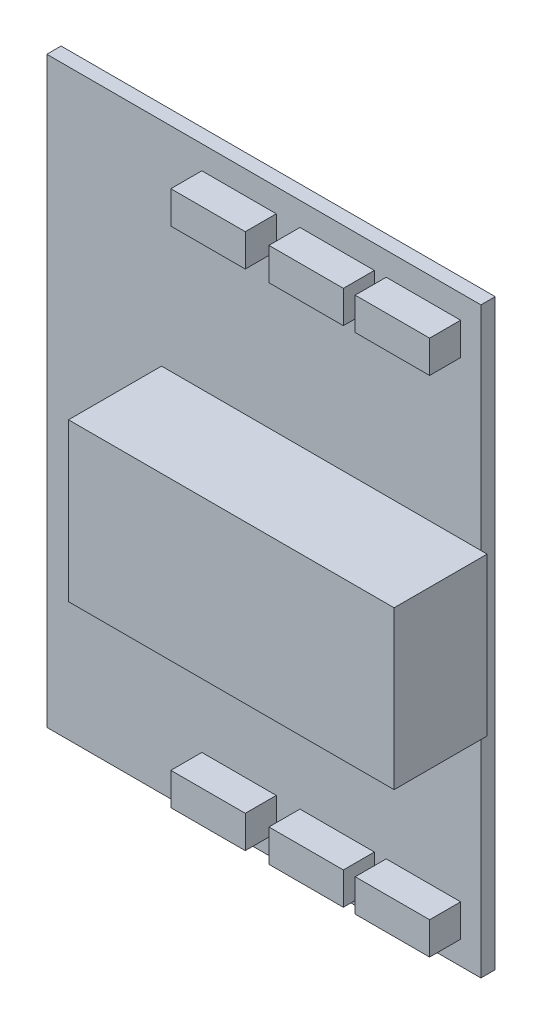
ISO-10303-21;
HEADER;
FILE_DESCRIPTION(('STEP AP214'),'2;1');
FILE_NAME('part.step','',(''),(''),'','','');
FILE_SCHEMA(('AUTOMOTIVE_DESIGN { 1 0 10303 214 1 1 1 1 }'));
ENDSEC;
DATA;
#1=APPLICATION_CONTEXT('core data for automotive mechanical design processes');
#2=APPLICATION_PROTOCOL_DEFINITION('international standard','automotive_design',2000,#1);
#3=PRODUCT_CONTEXT('',#1,'mechanical');
#4=PRODUCT('Part','Part','',(#3));
#5=PRODUCT_RELATED_PRODUCT_CATEGORY('part','',(#4));
#6=PRODUCT_DEFINITION_FORMATION('','',#4);
#7=PRODUCT_DEFINITION_CONTEXT('part definition',#1,'design');
#8=PRODUCT_DEFINITION('design','',#6,#7);
#9=PRODUCT_DEFINITION_SHAPE('','',#8);
#10=(LENGTH_UNIT() NAMED_UNIT(*) SI_UNIT(.MILLI.,.METRE.));
#11=(NAMED_UNIT(*) PLANE_ANGLE_UNIT() SI_UNIT($,.RADIAN.));
#12=(NAMED_UNIT(*) SI_UNIT($,.STERADIAN.) SOLID_ANGLE_UNIT());
#13=UNCERTAINTY_MEASURE_WITH_UNIT(LENGTH_MEASURE(1.E-05),#10,'distance_accuracy_value','');
#14=(GEOMETRIC_REPRESENTATION_CONTEXT(3) GLOBAL_UNCERTAINTY_ASSIGNED_CONTEXT((#13)) GLOBAL_UNIT_ASSIGNED_CONTEXT((#10,
#11,#12)) REPRESENTATION_CONTEXT('',''));
#15=CARTESIAN_POINT('',(0.,0.,0.));
#16=DIRECTION('',(0.,0.,1.));
#17=DIRECTION('',(1.,0.,0.));
#18=AXIS2_PLACEMENT_3D('',#15,#16,#17);
#19=CARTESIAN_POINT('',(0.,0.,2.3));
#20=DIRECTION('',(0.,0.,-1.));
#21=DIRECTION('',(-1.,0.,0.));
#22=AXIS2_PLACEMENT_3D('',#19,#20,#21);
#23=PLANE('',#22);
#24=DIRECTION('',(0.,-1.,0.));
#25=VECTOR('',#24,1.);
#26=CARTESIAN_POINT('',(19.7253103967378,0.,2.3));
#27=LINE('',#26,#25);
#28=CARTESIAN_POINT('',(19.7253103967378,-38.,2.3));
#29=VERTEX_POINT('',#28);
#30=CARTESIAN_POINT('',(19.7253103967378,-43.2204975659347,2.3));
#31=VERTEX_POINT('',#30);
#32=EDGE_CURVE('E289',#29,#31,#27,.T.);
#33=ORIENTED_EDGE('',*,*,#32,.F.);
#34=DIRECTION('',(1.,0.,0.));
#35=VECTOR('',#34,1.);
#36=CARTESIAN_POINT('',(0.,-38.,2.3));
#37=LINE('',#36,#35);
#38=CARTESIAN_POINT('',(31.7253103967378,-38.,2.3));
#39=VERTEX_POINT('',#38);
#40=EDGE_CURVE('E264',#29,#39,#37,.T.);
#41=ORIENTED_EDGE('',*,*,#40,.T.);
#42=DIRECTION('',(0.,-1.,0.));
#43=VECTOR('',#42,1.);
#44=CARTESIAN_POINT('',(31.7253103967378,0.,2.3));
#45=LINE('',#44,#43);
#46=CARTESIAN_POINT('',(31.7253103967378,-43.2204975659347,2.3));
#47=VERTEX_POINT('',#46);
#48=EDGE_CURVE('E280',#39,#47,#45,.T.);
#49=ORIENTED_EDGE('',*,*,#48,.T.);
#50=DIRECTION('',(1.,0.,0.));
#51=VECTOR('',#50,1.);
#52=CARTESIAN_POINT('',(0.,-43.2204975659347,2.3));
#53=LINE('',#52,#51);
#54=EDGE_CURVE('E54',#31,#47,#53,.T.);
#55=ORIENTED_EDGE('',*,*,#54,.F.);
#56=EDGE_LOOP('',(#33,#41,#49,#55));
#57=FACE_BOUND('',#56,.T.);
#58=DIRECTION('',(0.,-1.,0.));
#59=VECTOR('',#58,1.);
#60=CARTESIAN_POINT('',(5.81818108276089,0.,2.3));
#61=LINE('',#60,#59);
#62=CARTESIAN_POINT('',(5.81818108276089,-38.,2.3));
#63=VERTEX_POINT('',#62);
#64=CARTESIAN_POINT('',(5.81818108276089,-43.2204975659347,2.3));
#65=VERTEX_POINT('',#64);
#66=EDGE_CURVE('E310',#63,#65,#61,.T.);
#67=ORIENTED_EDGE('',*,*,#66,.F.);
#68=DIRECTION('',(1.,0.,0.));
#69=VECTOR('',#68,1.);
#70=CARTESIAN_POINT('',(0.,-38.,2.3));
#71=LINE('',#70,#69);
#72=CARTESIAN_POINT('',(17.8181810827609,-38.,2.3));
#73=VERTEX_POINT('',#72);
#74=EDGE_CURVE('E267',#63,#73,#71,.T.);
#75=ORIENTED_EDGE('',*,*,#74,.T.);
#76=DIRECTION('',(0.,-1.,0.));
#77=VECTOR('',#76,1.);
#78=CARTESIAN_POINT('',(17.8181810827609,0.,2.3));
#79=LINE('',#78,#77);
#80=CARTESIAN_POINT('',(17.8181810827609,-43.2204975659347,2.3));
#81=VERTEX_POINT('',#80);
#82=EDGE_CURVE('E300',#73,#81,#79,.T.);
#83=ORIENTED_EDGE('',*,*,#82,.T.);
#84=DIRECTION('',(1.,0.,0.));
#85=VECTOR('',#84,1.);
#86=CARTESIAN_POINT('',(0.,-43.2204975659347,2.3));
#87=LINE('',#86,#85);
#88=EDGE_CURVE('E62',#65,#81,#87,.T.);
#89=ORIENTED_EDGE('',*,*,#88,.F.);
#90=EDGE_LOOP('',(#67,#75,#83,#89));
#91=FACE_BOUND('',#90,.T.);
#92=DIRECTION('',(0.,-1.,0.));
#93=VECTOR('',#92,1.);
#94=CARTESIAN_POINT('',(-9.99999999999999,0.,2.3));
#95=LINE('',#94,#93);
#96=CARTESIAN_POINT('',(-9.99999999999999,-38.,2.3));
#97=VERTEX_POINT('',#96);
#98=CARTESIAN_POINT('',(-9.99999999999999,-43.2204975659347,2.3));
#99=VERTEX_POINT('',#98);
#100=EDGE_CURVE('E337',#97,#99,#95,.T.);
#101=ORIENTED_EDGE('',*,*,#100,.F.);
#102=DIRECTION('',(1.,0.,0.));
#103=VECTOR('',#102,1.);
#104=CARTESIAN_POINT('',(0.,-38.,2.3));
#105=LINE('',#104,#103);
#106=CARTESIAN_POINT('',(2.00000000000001,-38.,2.3));
#107=VERTEX_POINT('',#106);
#108=EDGE_CURVE('E322',#97,#107,#105,.T.);
#109=ORIENTED_EDGE('',*,*,#108,.T.);
#110=DIRECTION('',(0.,-1.,0.));
#111=VECTOR('',#110,1.);
#112=CARTESIAN_POINT('',(2.00000000000001,0.,2.3));
#113=LINE('',#112,#111);
#114=CARTESIAN_POINT('',(2.00000000000001,-43.2204975659347,2.3));
#115=VERTEX_POINT('',#114);
#116=EDGE_CURVE('E327',#107,#115,#113,.T.);
#117=ORIENTED_EDGE('',*,*,#116,.T.);
#118=DIRECTION('',(1.,0.,0.));
#119=VECTOR('',#118,1.);
#120=CARTESIAN_POINT('',(0.,-43.2204975659347,2.3));
#121=LINE('',#120,#119);
#122=EDGE_CURVE('E339',#99,#115,#121,.T.);
#123=ORIENTED_EDGE('',*,*,#122,.F.);
#124=EDGE_LOOP('',(#101,#109,#117,#123));
#125=FACE_BOUND('',#124,.T.);
#126=DIRECTION('',(1.,0.,0.));
#127=VECTOR('',#126,1.);
#128=CARTESIAN_POINT('',(0.,38.,2.3));
#129=LINE('',#128,#127);
#130=CARTESIAN_POINT('',(5.81818108276089,38.,2.3));
#131=VERTEX_POINT('',#130);
#132=CARTESIAN_POINT('',(17.8181810827609,38.,2.3));
#133=VERTEX_POINT('',#132);
#134=EDGE_CURVE('E384',#131,#133,#129,.T.);
#135=ORIENTED_EDGE('',*,*,#134,.F.);
#136=DIRECTION('',(0.,1.,0.));
#137=VECTOR('',#136,1.);
#138=CARTESIAN_POINT('',(5.81818108276089,0.,2.3));
#139=LINE('',#138,#137);
#140=CARTESIAN_POINT('',(5.81818108276089,43.2204975659347,2.3));
#141=VERTEX_POINT('',#140);
#142=EDGE_CURVE('E389',#131,#141,#139,.T.);
#143=ORIENTED_EDGE('',*,*,#142,.T.);
#144=DIRECTION('',(1.,0.,0.));
#145=VECTOR('',#144,1.);
#146=CARTESIAN_POINT('',(0.,43.2204975659347,2.3));
#147=LINE('',#146,#145);
#148=CARTESIAN_POINT('',(17.8181810827609,43.2204975659347,2.3));
#149=VERTEX_POINT('',#148);
#150=EDGE_CURVE('E403',#141,#149,#147,.T.);
#151=ORIENTED_EDGE('',*,*,#150,.T.);
#152=DIRECTION('',(0.,1.,0.));
#153=VECTOR('',#152,1.);
#154=CARTESIAN_POINT('',(17.8181810827609,0.,2.3));
#155=LINE('',#154,#153);
#156=EDGE_CURVE('E400',#133,#149,#155,.T.);
#157=ORIENTED_EDGE('',*,*,#156,.F.);
#158=EDGE_LOOP('',(#135,#143,#151,#157));
#159=FACE_BOUND('',#158,.T.);
#160=DIRECTION('',(-1.,0.,0.));
#161=VECTOR('',#160,1.);
#162=CARTESIAN_POINT('',(0.,12.7,2.3));
#163=LINE('',#162,#161);
#164=CARTESIAN_POINT('',(35.,12.7,2.3));
#165=VERTEX_POINT('',#164);
#166=CARTESIAN_POINT('',(-16.5,12.7,2.3));
#167=VERTEX_POINT('',#166);
#168=EDGE_CURVE('E11',#165,#167,#163,.T.);
#169=ORIENTED_EDGE('',*,*,#168,.F.);
#170=DIRECTION('',(0.,1.,0.));
#171=VECTOR('',#170,1.);
#172=CARTESIAN_POINT('',(35.,-47.,2.3));
#173=LINE('',#172,#171);
#174=CARTESIAN_POINT('',(35.,47.,2.3));
#175=VERTEX_POINT('',#174);
#176=EDGE_CURVE('E483',#165,#175,#173,.T.);
#177=ORIENTED_EDGE('',*,*,#176,.T.);
#178=DIRECTION('',(-1.,0.,0.));
#179=VECTOR('',#178,1.);
#180=CARTESIAN_POINT('',(-35.,47.,2.3));
#181=LINE('',#180,#179);
#182=CARTESIAN_POINT('',(-35.,47.,2.3));
#183=VERTEX_POINT('',#182);
#184=EDGE_CURVE('E481',#175,#183,#181,.T.);
#185=ORIENTED_EDGE('',*,*,#184,.T.);
#186=DIRECTION('',(0.,-1.,0.));
#187=VECTOR('',#186,1.);
#188=CARTESIAN_POINT('',(-35.,-47.,2.3));
#189=LINE('',#188,#187);
#190=CARTESIAN_POINT('',(-35.,-47.,2.3));
#191=VERTEX_POINT('',#190);
#192=EDGE_CURVE('E485',#183,#191,#189,.T.);
#193=ORIENTED_EDGE('',*,*,#192,.T.);
#194=DIRECTION('',(1.,0.,0.));
#195=VECTOR('',#194,1.);
#196=CARTESIAN_POINT('',(-35.,-47.,2.3));
#197=LINE('',#196,#195);
#198=CARTESIAN_POINT('',(35.,-47.,2.3));
#199=VERTEX_POINT('',#198);
#200=EDGE_CURVE('E487',#191,#199,#197,.T.);
#201=ORIENTED_EDGE('',*,*,#200,.T.);
#202=CARTESIAN_POINT('',(35.,-12.7,2.3));
#203=VERTEX_POINT('',#202);
#204=EDGE_CURVE('E478',#199,#203,#173,.T.);
#205=ORIENTED_EDGE('',*,*,#204,.T.);
#206=DIRECTION('',(-1.,0.,0.));
#207=VECTOR('',#206,1.);
#208=CARTESIAN_POINT('',(0.,-12.7,2.3));
#209=LINE('',#208,#207);
#210=CARTESIAN_POINT('',(-16.5,-12.7,2.3));
#211=VERTEX_POINT('',#210);
#212=EDGE_CURVE('E45',#203,#211,#209,.T.);
#213=ORIENTED_EDGE('',*,*,#212,.T.);
#214=DIRECTION('',(0.,-1.,0.));
#215=VECTOR('',#214,1.);
#216=CARTESIAN_POINT('',(-16.5,0.,2.3));
#217=LINE('',#216,#215);
#218=EDGE_CURVE('E448',#167,#211,#217,.T.);
#219=ORIENTED_EDGE('',*,*,#218,.F.);
#220=EDGE_LOOP('',(#169,#177,#185,#193,#201,#205,#213,#219));
#221=FACE_BOUND('',#220,.T.);
#222=DIRECTION('',(1.,0.,0.));
#223=VECTOR('',#222,1.);
#224=CARTESIAN_POINT('',(0.,38.,2.3));
#225=LINE('',#224,#223);
#226=CARTESIAN_POINT('',(-9.99999999999999,38.,2.3));
#227=VERTEX_POINT('',#226);
#228=CARTESIAN_POINT('',(2.00000000000001,38.,2.3));
#229=VERTEX_POINT('',#228);
#230=EDGE_CURVE('E416',#227,#229,#225,.T.);
#231=ORIENTED_EDGE('',*,*,#230,.F.);
#232=DIRECTION('',(0.,1.,0.));
#233=VECTOR('',#232,1.);
#234=CARTESIAN_POINT('',(-9.99999999999999,0.,2.3));
#235=LINE('',#234,#233);
#236=CARTESIAN_POINT('',(-9.99999999999999,43.2204975659347,2.3));
#237=VERTEX_POINT('',#236);
#238=EDGE_CURVE('E421',#227,#237,#235,.T.);
#239=ORIENTED_EDGE('',*,*,#238,.T.);
#240=DIRECTION('',(1.,0.,0.));
#241=VECTOR('',#240,1.);
#242=CARTESIAN_POINT('',(0.,43.2204975659347,2.3));
#243=LINE('',#242,#241);
#244=CARTESIAN_POINT('',(2.00000000000001,43.2204975659347,2.3));
#245=VERTEX_POINT('',#244);
#246=EDGE_CURVE('E435',#237,#245,#243,.T.);
#247=ORIENTED_EDGE('',*,*,#246,.T.);
#248=DIRECTION('',(0.,1.,0.));
#249=VECTOR('',#248,1.);
#250=CARTESIAN_POINT('',(2.00000000000001,0.,2.3));
#251=LINE('',#250,#249);
#252=EDGE_CURVE('E432',#229,#245,#251,.T.);
#253=ORIENTED_EDGE('',*,*,#252,.F.);
#254=EDGE_LOOP('',(#231,#239,#247,#253));
#255=FACE_BOUND('',#254,.T.);
#256=DIRECTION('',(1.,0.,0.));
#257=VECTOR('',#256,1.);
#258=CARTESIAN_POINT('',(0.,38.,2.3));
#259=LINE('',#258,#257);
#260=CARTESIAN_POINT('',(19.7253103967378,38.,2.3));
#261=VERTEX_POINT('',#260);
#262=CARTESIAN_POINT('',(31.7253103967378,38.,2.3));
#263=VERTEX_POINT('',#262);
#264=EDGE_CURVE('E352',#261,#263,#259,.T.);
#265=ORIENTED_EDGE('',*,*,#264,.F.);
#266=DIRECTION('',(0.,1.,0.));
#267=VECTOR('',#266,1.);
#268=CARTESIAN_POINT('',(19.7253103967378,0.,2.3));
#269=LINE('',#268,#267);
#270=CARTESIAN_POINT('',(19.7253103967378,43.2204975659347,2.3));
#271=VERTEX_POINT('',#270);
#272=EDGE_CURVE('E357',#261,#271,#269,.T.);
#273=ORIENTED_EDGE('',*,*,#272,.T.);
#274=DIRECTION('',(1.,0.,0.));
#275=VECTOR('',#274,1.);
#276=CARTESIAN_POINT('',(0.,43.2204975659347,2.3));
#277=LINE('',#276,#275);
#278=CARTESIAN_POINT('',(31.7253103967378,43.2204975659347,2.3));
#279=VERTEX_POINT('',#278);
#280=EDGE_CURVE('E371',#271,#279,#277,.T.);
#281=ORIENTED_EDGE('',*,*,#280,.T.);
#282=DIRECTION('',(0.,1.,0.));
#283=VECTOR('',#282,1.);
#284=CARTESIAN_POINT('',(31.7253103967378,0.,2.3));
#285=LINE('',#284,#283);
#286=EDGE_CURVE('E368',#263,#279,#285,.T.);
#287=ORIENTED_EDGE('',*,*,#286,.F.);
#288=EDGE_LOOP('',(#265,#273,#281,#287));
#289=FACE_BOUND('',#288,.T.);
#290=ADVANCED_FACE('F36',(#57,#91,#125,#159,#221,#255,#289),#23,.F.);
#291=CARTESIAN_POINT('',(35.,-47.,2.3));
#292=DIRECTION('',(-1.,0.,0.));
#293=DIRECTION('',(0.,0.,1.));
#294=AXIS2_PLACEMENT_3D('',#291,#292,#293);
#295=PLANE('',#294);
#296=DIRECTION('',(0.,1.,0.));
#297=VECTOR('',#296,1.);
#298=CARTESIAN_POINT('',(35.,-47.,0.));
#299=LINE('',#298,#297);
#300=CARTESIAN_POINT('',(35.,-47.,0.));
#301=VERTEX_POINT('',#300);
#302=CARTESIAN_POINT('',(35.,47.,0.));
#303=VERTEX_POINT('',#302);
#304=EDGE_CURVE('E477',#301,#303,#299,.T.);
#305=ORIENTED_EDGE('',*,*,#304,.T.);
#306=DIRECTION('',(0.,0.,-1.));
#307=VECTOR('',#306,1.);
#308=CARTESIAN_POINT('',(35.,47.,2.3));
#309=LINE('',#308,#307);
#310=EDGE_CURVE('E40',#175,#303,#309,.T.);
#311=ORIENTED_EDGE('',*,*,#310,.F.);
#312=ORIENTED_EDGE('',*,*,#176,.F.);
#313=EDGE_CURVE('E482',#203,#165,#173,.T.);
#314=ORIENTED_EDGE('',*,*,#313,.F.);
#315=ORIENTED_EDGE('',*,*,#204,.F.);
#316=DIRECTION('',(0.,0.,-1.));
#317=VECTOR('',#316,1.);
#318=CARTESIAN_POINT('',(35.,-47.,2.3));
#319=LINE('',#318,#317);
#320=EDGE_CURVE('E489',#199,#301,#319,.T.);
#321=ORIENTED_EDGE('',*,*,#320,.T.);
#322=EDGE_LOOP('',(#305,#311,#312,#314,#315,#321));
#323=FACE_BOUND('',#322,.T.);
#324=ADVANCED_FACE('F38',(#323),#295,.F.);
#325=CARTESIAN_POINT('',(-35.,47.,2.3));
#326=DIRECTION('',(0.,-1.,0.));
#327=DIRECTION('',(0.,0.,-1.));
#328=AXIS2_PLACEMENT_3D('',#325,#326,#327);
#329=PLANE('',#328);
#330=DIRECTION('',(-1.,0.,0.));
#331=VECTOR('',#330,1.);
#332=CARTESIAN_POINT('',(-35.,47.,0.));
#333=LINE('',#332,#331);
#334=CARTESIAN_POINT('',(-35.,47.,0.));
#335=VERTEX_POINT('',#334);
#336=EDGE_CURVE('E492',#303,#335,#333,.T.);
#337=ORIENTED_EDGE('',*,*,#336,.T.);
#338=DIRECTION('',(0.,0.,-1.));
#339=VECTOR('',#338,1.);
#340=CARTESIAN_POINT('',(-35.,47.,2.3));
#341=LINE('',#340,#339);
#342=EDGE_CURVE('E502',#183,#335,#341,.T.);
#343=ORIENTED_EDGE('',*,*,#342,.F.);
#344=ORIENTED_EDGE('',*,*,#184,.F.);
#345=ORIENTED_EDGE('',*,*,#310,.T.);
#346=EDGE_LOOP('',(#337,#343,#344,#345));
#347=FACE_BOUND('',#346,.T.);
#348=ADVANCED_FACE('F529',(#347),#329,.F.);
#349=CARTESIAN_POINT('',(-35.,-47.,2.3));
#350=DIRECTION('',(1.,0.,0.));
#351=DIRECTION('',(0.,0.,-1.));
#352=AXIS2_PLACEMENT_3D('',#349,#350,#351);
#353=PLANE('',#352);
#354=DIRECTION('',(0.,-1.,0.));
#355=VECTOR('',#354,1.);
#356=CARTESIAN_POINT('',(-35.,-47.,0.));
#357=LINE('',#356,#355);
#358=CARTESIAN_POINT('',(-35.,-47.,0.));
#359=VERTEX_POINT('',#358);
#360=EDGE_CURVE('E494',#335,#359,#357,.T.);
#361=ORIENTED_EDGE('',*,*,#360,.T.);
#362=DIRECTION('',(0.,0.,-1.));
#363=VECTOR('',#362,1.);
#364=CARTESIAN_POINT('',(-35.,-47.,2.3));
#365=LINE('',#364,#363);
#366=EDGE_CURVE('E500',#191,#359,#365,.T.);
#367=ORIENTED_EDGE('',*,*,#366,.F.);
#368=ORIENTED_EDGE('',*,*,#192,.F.);
#369=ORIENTED_EDGE('',*,*,#342,.T.);
#370=EDGE_LOOP('',(#361,#367,#368,#369));
#371=FACE_BOUND('',#370,.T.);
#372=ADVANCED_FACE('F536',(#371),#353,.F.);
#373=CARTESIAN_POINT('',(-35.,-47.,2.3));
#374=DIRECTION('',(0.,1.,0.));
#375=DIRECTION('',(0.,0.,1.));
#376=AXIS2_PLACEMENT_3D('',#373,#374,#375);
#377=PLANE('',#376);
#378=DIRECTION('',(1.,0.,0.));
#379=VECTOR('',#378,1.);
#380=CARTESIAN_POINT('',(-35.,-47.,0.));
#381=LINE('',#380,#379);
#382=EDGE_CURVE('E496',#359,#301,#381,.T.);
#383=ORIENTED_EDGE('',*,*,#382,.T.);
#384=ORIENTED_EDGE('',*,*,#320,.F.);
#385=ORIENTED_EDGE('',*,*,#200,.F.);
#386=ORIENTED_EDGE('',*,*,#366,.T.);
#387=EDGE_LOOP('',(#383,#384,#385,#386));
#388=FACE_BOUND('',#387,.T.);
#389=ADVANCED_FACE('F539',(#388),#377,.F.);
#390=CARTESIAN_POINT('',(0.,0.,0.));
#391=DIRECTION('',(0.,0.,-1.));
#392=DIRECTION('',(-1.,0.,0.));
#393=AXIS2_PLACEMENT_3D('',#390,#391,#392);
#394=PLANE('',#393);
#395=ORIENTED_EDGE('',*,*,#304,.F.);
#396=ORIENTED_EDGE('',*,*,#382,.F.);
#397=ORIENTED_EDGE('',*,*,#360,.F.);
#398=ORIENTED_EDGE('',*,*,#336,.F.);
#399=EDGE_LOOP('',(#395,#396,#397,#398));
#400=FACE_BOUND('',#399,.T.);
#401=ADVANCED_FACE('F534',(#400),#394,.T.);
#402=CARTESIAN_POINT('',(0.,0.,2.3));
#403=DIRECTION('',(0.,0.,1.));
#404=DIRECTION('',(1.,0.,0.));
#405=AXIS2_PLACEMENT_3D('',#402,#403,#404);
#406=PLANE('',#405);
#407=CARTESIAN_POINT('',(36.,-12.7,2.3));
#408=VERTEX_POINT('',#407);
#409=EDGE_CURVE('E461',#408,#203,#209,.T.);
#410=ORIENTED_EDGE('',*,*,#409,.T.);
#411=ORIENTED_EDGE('',*,*,#313,.T.);
#412=CARTESIAN_POINT('',(36.,12.7,2.3));
#413=VERTEX_POINT('',#412);
#414=EDGE_CURVE('E47',#413,#165,#163,.T.);
#415=ORIENTED_EDGE('',*,*,#414,.F.);
#416=DIRECTION('',(0.,-1.,0.));
#417=VECTOR('',#416,1.);
#418=CARTESIAN_POINT('',(36.,0.,2.3));
#419=LINE('',#418,#417);
#420=EDGE_CURVE('E464',#413,#408,#419,.T.);
#421=ORIENTED_EDGE('',*,*,#420,.T.);
#422=EDGE_LOOP('',(#410,#411,#415,#421));
#423=FACE_BOUND('',#422,.T.);
#424=ADVANCED_FACE('F524',(#423),#406,.F.);
#425=CARTESIAN_POINT('',(-16.5,0.,17.3));
#426=DIRECTION('',(1.,0.,0.));
#427=DIRECTION('',(0.,0.,-1.));
#428=AXIS2_PLACEMENT_3D('',#425,#426,#427);
#429=PLANE('',#428);
#430=ORIENTED_EDGE('',*,*,#218,.T.);
#431=DIRECTION('',(0.,0.,-1.));
#432=VECTOR('',#431,1.);
#433=CARTESIAN_POINT('',(-16.5,-12.7,17.3));
#434=LINE('',#433,#432);
#435=CARTESIAN_POINT('',(-16.5,-12.7,17.3));
#436=VERTEX_POINT('',#435);
#437=EDGE_CURVE('E474',#436,#211,#434,.T.);
#438=ORIENTED_EDGE('',*,*,#437,.F.);
#439=DIRECTION('',(0.,-1.,0.));
#440=VECTOR('',#439,1.);
#441=CARTESIAN_POINT('',(-16.5,0.,17.3));
#442=LINE('',#441,#440);
#443=CARTESIAN_POINT('',(-16.5,12.7,17.3));
#444=VERTEX_POINT('',#443);
#445=EDGE_CURVE('E449',#444,#436,#442,.T.);
#446=ORIENTED_EDGE('',*,*,#445,.F.);
#447=DIRECTION('',(0.,0.,-1.));
#448=VECTOR('',#447,1.);
#449=CARTESIAN_POINT('',(-16.5,12.7,17.3));
#450=LINE('',#449,#448);
#451=EDGE_CURVE('E459',#444,#167,#450,.T.);
#452=ORIENTED_EDGE('',*,*,#451,.T.);
#453=EDGE_LOOP('',(#430,#438,#446,#452));
#454=FACE_BOUND('',#453,.T.);
#455=ADVANCED_FACE('F556',(#454),#429,.F.);
#456=CARTESIAN_POINT('',(0.,-12.7,17.3));
#457=DIRECTION('',(0.,-1.,0.));
#458=DIRECTION('',(0.,0.,-1.));
#459=AXIS2_PLACEMENT_3D('',#456,#457,#458);
#460=PLANE('',#459);
#461=ORIENTED_EDGE('',*,*,#409,.F.);
#462=DIRECTION('',(0.,0.,-1.));
#463=VECTOR('',#462,1.);
#464=CARTESIAN_POINT('',(36.,-12.7,17.3));
#465=LINE('',#464,#463);
#466=CARTESIAN_POINT('',(36.,-12.7,17.3));
#467=VERTEX_POINT('',#466);
#468=EDGE_CURVE('E472',#467,#408,#465,.T.);
#469=ORIENTED_EDGE('',*,*,#468,.F.);
#470=DIRECTION('',(-1.,0.,0.));
#471=VECTOR('',#470,1.);
#472=CARTESIAN_POINT('',(0.,-12.7,17.3));
#473=LINE('',#472,#471);
#474=EDGE_CURVE('E451',#467,#436,#473,.T.);
#475=ORIENTED_EDGE('',*,*,#474,.T.);
#476=ORIENTED_EDGE('',*,*,#437,.T.);
#477=ORIENTED_EDGE('',*,*,#212,.F.);
#478=EDGE_LOOP('',(#461,#469,#475,#476,#477));
#479=FACE_BOUND('',#478,.T.);
#480=ADVANCED_FACE('F520',(#479),#460,.T.);
#481=CARTESIAN_POINT('',(36.,0.,17.3));
#482=DIRECTION('',(1.,0.,0.));
#483=DIRECTION('',(0.,0.,-1.));
#484=AXIS2_PLACEMENT_3D('',#481,#482,#483);
#485=PLANE('',#484);
#486=ORIENTED_EDGE('',*,*,#420,.F.);
#487=DIRECTION('',(0.,0.,-1.));
#488=VECTOR('',#487,1.);
#489=CARTESIAN_POINT('',(36.,12.7,17.3));
#490=LINE('',#489,#488);
#491=CARTESIAN_POINT('',(36.,12.7,17.3));
#492=VERTEX_POINT('',#491);
#493=EDGE_CURVE('E470',#492,#413,#490,.T.);
#494=ORIENTED_EDGE('',*,*,#493,.F.);
#495=DIRECTION('',(0.,-1.,0.));
#496=VECTOR('',#495,1.);
#497=CARTESIAN_POINT('',(36.,0.,17.3));
#498=LINE('',#497,#496);
#499=EDGE_CURVE('E454',#492,#467,#498,.T.);
#500=ORIENTED_EDGE('',*,*,#499,.T.);
#501=ORIENTED_EDGE('',*,*,#468,.T.);
#502=EDGE_LOOP('',(#486,#494,#500,#501));
#503=FACE_BOUND('',#502,.T.);
#504=ADVANCED_FACE('F562',(#503),#485,.T.);
#505=CARTESIAN_POINT('',(0.,12.7,17.3));
#506=DIRECTION('',(0.,-1.,0.));
#507=DIRECTION('',(1.,0.,0.));
#508=AXIS2_PLACEMENT_3D('',#505,#506,#507);
#509=PLANE('',#508);
#510=ORIENTED_EDGE('',*,*,#414,.T.);
#511=ORIENTED_EDGE('',*,*,#168,.T.);
#512=ORIENTED_EDGE('',*,*,#451,.F.);
#513=DIRECTION('',(-1.,0.,0.));
#514=VECTOR('',#513,1.);
#515=CARTESIAN_POINT('',(0.,12.7,17.3));
#516=LINE('',#515,#514);
#517=EDGE_CURVE('E457',#492,#444,#516,.T.);
#518=ORIENTED_EDGE('',*,*,#517,.F.);
#519=ORIENTED_EDGE('',*,*,#493,.T.);
#520=EDGE_LOOP('',(#510,#511,#512,#518,#519));
#521=FACE_BOUND('',#520,.T.);
#522=ADVANCED_FACE('F565',(#521),#509,.F.);
#523=CARTESIAN_POINT('',(0.,0.,17.3));
#524=DIRECTION('',(0.,0.,1.));
#525=DIRECTION('',(1.,0.,0.));
#526=AXIS2_PLACEMENT_3D('',#523,#524,#525);
#527=PLANE('',#526);
#528=ORIENTED_EDGE('',*,*,#445,.T.);
#529=ORIENTED_EDGE('',*,*,#474,.F.);
#530=ORIENTED_EDGE('',*,*,#499,.F.);
#531=ORIENTED_EDGE('',*,*,#517,.T.);
#532=EDGE_LOOP('',(#528,#529,#530,#531));
#533=FACE_BOUND('',#532,.T.);
#534=ADVANCED_FACE('F569',(#533),#527,.T.);
#535=CARTESIAN_POINT('',(0.,38.,7.3));
#536=DIRECTION('',(0.,1.,0.));
#537=DIRECTION('',(0.,0.,1.));
#538=AXIS2_PLACEMENT_3D('',#535,#536,#537);
#539=PLANE('',#538);
#540=ORIENTED_EDGE('',*,*,#230,.T.);
#541=DIRECTION('',(0.,0.,-1.));
#542=VECTOR('',#541,1.);
#543=CARTESIAN_POINT('',(2.00000000000001,38.,7.3));
#544=LINE('',#543,#542);
#545=CARTESIAN_POINT('',(2.00000000000001,38.,7.3));
#546=VERTEX_POINT('',#545);
#547=EDGE_CURVE('E446',#546,#229,#544,.T.);
#548=ORIENTED_EDGE('',*,*,#547,.F.);
#549=DIRECTION('',(1.,0.,0.));
#550=VECTOR('',#549,1.);
#551=CARTESIAN_POINT('',(0.,38.,7.3));
#552=LINE('',#551,#550);
#553=CARTESIAN_POINT('',(-9.99999999999999,38.,7.3));
#554=VERTEX_POINT('',#553);
#555=EDGE_CURVE('E417',#554,#546,#552,.T.);
#556=ORIENTED_EDGE('',*,*,#555,.F.);
#557=DIRECTION('',(0.,0.,-1.));
#558=VECTOR('',#557,1.);
#559=CARTESIAN_POINT('',(-9.99999999999999,38.,7.3));
#560=LINE('',#559,#558);
#561=EDGE_CURVE('E429',#554,#227,#560,.T.);
#562=ORIENTED_EDGE('',*,*,#561,.T.);
#563=EDGE_LOOP('',(#540,#548,#556,#562));
#564=FACE_BOUND('',#563,.T.);
#565=ADVANCED_FACE('F575',(#564),#539,.F.);
#566=CARTESIAN_POINT('',(2.00000000000001,0.,7.3));
#567=DIRECTION('',(-1.,0.,0.));
#568=DIRECTION('',(0.,0.,1.));
#569=AXIS2_PLACEMENT_3D('',#566,#567,#568);
#570=PLANE('',#569);
#571=ORIENTED_EDGE('',*,*,#252,.T.);
#572=DIRECTION('',(0.,0.,-1.));
#573=VECTOR('',#572,1.);
#574=CARTESIAN_POINT('',(2.00000000000001,43.2204975659347,7.3));
#575=LINE('',#574,#573);
#576=CARTESIAN_POINT('',(2.00000000000001,43.2204975659347,7.3));
#577=VERTEX_POINT('',#576);
#578=EDGE_CURVE('E444',#577,#245,#575,.T.);
#579=ORIENTED_EDGE('',*,*,#578,.F.);
#580=DIRECTION('',(0.,1.,0.));
#581=VECTOR('',#580,1.);
#582=CARTESIAN_POINT('',(2.00000000000001,0.,7.3));
#583=LINE('',#582,#581);
#584=EDGE_CURVE('E420',#546,#577,#583,.T.);
#585=ORIENTED_EDGE('',*,*,#584,.F.);
#586=ORIENTED_EDGE('',*,*,#547,.T.);
#587=EDGE_LOOP('',(#571,#579,#585,#586));
#588=FACE_BOUND('',#587,.T.);
#589=ADVANCED_FACE('F579',(#588),#570,.F.);
#590=CARTESIAN_POINT('',(0.,43.2204975659347,7.3));
#591=DIRECTION('',(0.,1.,0.));
#592=DIRECTION('',(0.,0.,1.));
#593=AXIS2_PLACEMENT_3D('',#590,#591,#592);
#594=PLANE('',#593);
#595=ORIENTED_EDGE('',*,*,#246,.F.);
#596=DIRECTION('',(0.,0.,-1.));
#597=VECTOR('',#596,1.);
#598=CARTESIAN_POINT('',(-9.99999999999999,43.2204975659347,7.3));
#599=LINE('',#598,#597);
#600=CARTESIAN_POINT('',(-9.99999999999999,43.2204975659347,7.3));
#601=VERTEX_POINT('',#600);
#602=EDGE_CURVE('E441',#601,#237,#599,.T.);
#603=ORIENTED_EDGE('',*,*,#602,.F.);
#604=DIRECTION('',(1.,0.,0.));
#605=VECTOR('',#604,1.);
#606=CARTESIAN_POINT('',(0.,43.2204975659347,7.3));
#607=LINE('',#606,#605);
#608=EDGE_CURVE('E423',#601,#577,#607,.T.);
#609=ORIENTED_EDGE('',*,*,#608,.T.);
#610=ORIENTED_EDGE('',*,*,#578,.T.);
#611=EDGE_LOOP('',(#595,#603,#609,#610));
#612=FACE_BOUND('',#611,.T.);
#613=ADVANCED_FACE('F583',(#612),#594,.T.);
#614=CARTESIAN_POINT('',(-9.99999999999999,0.,7.3));
#615=DIRECTION('',(-1.,0.,0.));
#616=DIRECTION('',(0.,0.,1.));
#617=AXIS2_PLACEMENT_3D('',#614,#615,#616);
#618=PLANE('',#617);
#619=ORIENTED_EDGE('',*,*,#238,.F.);
#620=ORIENTED_EDGE('',*,*,#561,.F.);
#621=DIRECTION('',(0.,1.,0.));
#622=VECTOR('',#621,1.);
#623=CARTESIAN_POINT('',(-9.99999999999999,0.,7.3));
#624=LINE('',#623,#622);
#625=EDGE_CURVE('E426',#554,#601,#624,.T.);
#626=ORIENTED_EDGE('',*,*,#625,.T.);
#627=ORIENTED_EDGE('',*,*,#602,.T.);
#628=EDGE_LOOP('',(#619,#620,#626,#627));
#629=FACE_BOUND('',#628,.T.);
#630=ADVANCED_FACE('F587',(#629),#618,.T.);
#631=CARTESIAN_POINT('',(0.,0.,7.3));
#632=DIRECTION('',(0.,0.,1.));
#633=DIRECTION('',(1.,0.,0.));
#634=AXIS2_PLACEMENT_3D('',#631,#632,#633);
#635=PLANE('',#634);
#636=ORIENTED_EDGE('',*,*,#555,.T.);
#637=ORIENTED_EDGE('',*,*,#584,.T.);
#638=ORIENTED_EDGE('',*,*,#608,.F.);
#639=ORIENTED_EDGE('',*,*,#625,.F.);
#640=EDGE_LOOP('',(#636,#637,#638,#639));
#641=FACE_BOUND('',#640,.T.);
#642=ADVANCED_FACE('F591',(#641),#635,.T.);
#643=CARTESIAN_POINT('',(0.,38.,7.3));
#644=DIRECTION('',(0.,1.,0.));
#645=DIRECTION('',(0.,0.,1.));
#646=AXIS2_PLACEMENT_3D('',#643,#644,#645);
#647=PLANE('',#646);
#648=ORIENTED_EDGE('',*,*,#134,.T.);
#649=DIRECTION('',(0.,0.,-1.));
#650=VECTOR('',#649,1.);
#651=CARTESIAN_POINT('',(17.8181810827609,38.,7.3));
#652=LINE('',#651,#650);
#653=CARTESIAN_POINT('',(17.8181810827609,38.,7.3));
#654=VERTEX_POINT('',#653);
#655=EDGE_CURVE('E414',#654,#133,#652,.T.);
#656=ORIENTED_EDGE('',*,*,#655,.F.);
#657=DIRECTION('',(1.,0.,0.));
#658=VECTOR('',#657,1.);
#659=CARTESIAN_POINT('',(0.,38.,7.3));
#660=LINE('',#659,#658);
#661=CARTESIAN_POINT('',(5.81818108276089,38.,7.3));
#662=VERTEX_POINT('',#661);
#663=EDGE_CURVE('E385',#662,#654,#660,.T.);
#664=ORIENTED_EDGE('',*,*,#663,.F.);
#665=DIRECTION('',(0.,0.,-1.));
#666=VECTOR('',#665,1.);
#667=CARTESIAN_POINT('',(5.81818108276089,38.,7.3));
#668=LINE('',#667,#666);
#669=EDGE_CURVE('E397',#662,#131,#668,.T.);
#670=ORIENTED_EDGE('',*,*,#669,.T.);
#671=EDGE_LOOP('',(#648,#656,#664,#670));
#672=FACE_BOUND('',#671,.T.);
#673=ADVANCED_FACE('F595',(#672),#647,.F.);
#674=CARTESIAN_POINT('',(17.8181810827609,0.,7.3));
#675=DIRECTION('',(-1.,0.,0.));
#676=DIRECTION('',(0.,0.,1.));
#677=AXIS2_PLACEMENT_3D('',#674,#675,#676);
#678=PLANE('',#677);
#679=ORIENTED_EDGE('',*,*,#156,.T.);
#680=DIRECTION('',(0.,0.,-1.));
#681=VECTOR('',#680,1.);
#682=CARTESIAN_POINT('',(17.8181810827609,43.2204975659347,7.3));
#683=LINE('',#682,#681);
#684=CARTESIAN_POINT('',(17.8181810827609,43.2204975659347,7.3));
#685=VERTEX_POINT('',#684);
#686=EDGE_CURVE('E412',#685,#149,#683,.T.);
#687=ORIENTED_EDGE('',*,*,#686,.F.);
#688=DIRECTION('',(0.,1.,0.));
#689=VECTOR('',#688,1.);
#690=CARTESIAN_POINT('',(17.8181810827609,0.,7.3));
#691=LINE('',#690,#689);
#692=EDGE_CURVE('E388',#654,#685,#691,.T.);
#693=ORIENTED_EDGE('',*,*,#692,.F.);
#694=ORIENTED_EDGE('',*,*,#655,.T.);
#695=EDGE_LOOP('',(#679,#687,#693,#694));
#696=FACE_BOUND('',#695,.T.);
#697=ADVANCED_FACE('F599',(#696),#678,.F.);
#698=CARTESIAN_POINT('',(0.,43.2204975659347,7.3));
#699=DIRECTION('',(0.,1.,0.));
#700=DIRECTION('',(0.,0.,1.));
#701=AXIS2_PLACEMENT_3D('',#698,#699,#700);
#702=PLANE('',#701);
#703=ORIENTED_EDGE('',*,*,#150,.F.);
#704=DIRECTION('',(0.,0.,-1.));
#705=VECTOR('',#704,1.);
#706=CARTESIAN_POINT('',(5.81818108276089,43.2204975659347,7.3));
#707=LINE('',#706,#705);
#708=CARTESIAN_POINT('',(5.81818108276089,43.2204975659347,7.3));
#709=VERTEX_POINT('',#708);
#710=EDGE_CURVE('E409',#709,#141,#707,.T.);
#711=ORIENTED_EDGE('',*,*,#710,.F.);
#712=DIRECTION('',(1.,0.,0.));
#713=VECTOR('',#712,1.);
#714=CARTESIAN_POINT('',(0.,43.2204975659347,7.3));
#715=LINE('',#714,#713);
#716=EDGE_CURVE('E391',#709,#685,#715,.T.);
#717=ORIENTED_EDGE('',*,*,#716,.T.);
#718=ORIENTED_EDGE('',*,*,#686,.T.);
#719=EDGE_LOOP('',(#703,#711,#717,#718));
#720=FACE_BOUND('',#719,.T.);
#721=ADVANCED_FACE('F603',(#720),#702,.T.);
#722=CARTESIAN_POINT('',(5.81818108276089,0.,7.3));
#723=DIRECTION('',(-1.,0.,0.));
#724=DIRECTION('',(0.,0.,1.));
#725=AXIS2_PLACEMENT_3D('',#722,#723,#724);
#726=PLANE('',#725);
#727=ORIENTED_EDGE('',*,*,#142,.F.);
#728=ORIENTED_EDGE('',*,*,#669,.F.);
#729=DIRECTION('',(0.,1.,0.));
#730=VECTOR('',#729,1.);
#731=CARTESIAN_POINT('',(5.81818108276089,0.,7.3));
#732=LINE('',#731,#730);
#733=EDGE_CURVE('E394',#662,#709,#732,.T.);
#734=ORIENTED_EDGE('',*,*,#733,.T.);
#735=ORIENTED_EDGE('',*,*,#710,.T.);
#736=EDGE_LOOP('',(#727,#728,#734,#735));
#737=FACE_BOUND('',#736,.T.);
#738=ADVANCED_FACE('F607',(#737),#726,.T.);
#739=CARTESIAN_POINT('',(0.,0.,7.3));
#740=DIRECTION('',(0.,0.,1.));
#741=DIRECTION('',(1.,0.,0.));
#742=AXIS2_PLACEMENT_3D('',#739,#740,#741);
#743=PLANE('',#742);
#744=ORIENTED_EDGE('',*,*,#663,.T.);
#745=ORIENTED_EDGE('',*,*,#692,.T.);
#746=ORIENTED_EDGE('',*,*,#716,.F.);
#747=ORIENTED_EDGE('',*,*,#733,.F.);
#748=EDGE_LOOP('',(#744,#745,#746,#747));
#749=FACE_BOUND('',#748,.T.);
#750=ADVANCED_FACE('F611',(#749),#743,.T.);
#751=CARTESIAN_POINT('',(0.,38.,7.3));
#752=DIRECTION('',(0.,1.,0.));
#753=DIRECTION('',(0.,0.,1.));
#754=AXIS2_PLACEMENT_3D('',#751,#752,#753);
#755=PLANE('',#754);
#756=ORIENTED_EDGE('',*,*,#264,.T.);
#757=DIRECTION('',(0.,0.,-1.));
#758=VECTOR('',#757,1.);
#759=CARTESIAN_POINT('',(31.7253103967378,38.,7.3));
#760=LINE('',#759,#758);
#761=CARTESIAN_POINT('',(31.7253103967378,38.,7.3));
#762=VERTEX_POINT('',#761);
#763=EDGE_CURVE('E382',#762,#263,#760,.T.);
#764=ORIENTED_EDGE('',*,*,#763,.F.);
#765=DIRECTION('',(1.,0.,0.));
#766=VECTOR('',#765,1.);
#767=CARTESIAN_POINT('',(0.,38.,7.3));
#768=LINE('',#767,#766);
#769=CARTESIAN_POINT('',(19.7253103967378,38.,7.3));
#770=VERTEX_POINT('',#769);
#771=EDGE_CURVE('E353',#770,#762,#768,.T.);
#772=ORIENTED_EDGE('',*,*,#771,.F.);
#773=DIRECTION('',(0.,0.,-1.));
#774=VECTOR('',#773,1.);
#775=CARTESIAN_POINT('',(19.7253103967378,38.,7.3));
#776=LINE('',#775,#774);
#777=EDGE_CURVE('E365',#770,#261,#776,.T.);
#778=ORIENTED_EDGE('',*,*,#777,.T.);
#779=EDGE_LOOP('',(#756,#764,#772,#778));
#780=FACE_BOUND('',#779,.T.);
#781=ADVANCED_FACE('F615',(#780),#755,.F.);
#782=CARTESIAN_POINT('',(31.7253103967378,0.,7.3));
#783=DIRECTION('',(-1.,0.,0.));
#784=DIRECTION('',(0.,0.,1.));
#785=AXIS2_PLACEMENT_3D('',#782,#783,#784);
#786=PLANE('',#785);
#787=ORIENTED_EDGE('',*,*,#286,.T.);
#788=DIRECTION('',(0.,0.,-1.));
#789=VECTOR('',#788,1.);
#790=CARTESIAN_POINT('',(31.7253103967378,43.2204975659347,7.3));
#791=LINE('',#790,#789);
#792=CARTESIAN_POINT('',(31.7253103967378,43.2204975659347,7.3));
#793=VERTEX_POINT('',#792);
#794=EDGE_CURVE('E380',#793,#279,#791,.T.);
#795=ORIENTED_EDGE('',*,*,#794,.F.);
#796=DIRECTION('',(0.,1.,0.));
#797=VECTOR('',#796,1.);
#798=CARTESIAN_POINT('',(31.7253103967378,0.,7.3));
#799=LINE('',#798,#797);
#800=EDGE_CURVE('E356',#762,#793,#799,.T.);
#801=ORIENTED_EDGE('',*,*,#800,.F.);
#802=ORIENTED_EDGE('',*,*,#763,.T.);
#803=EDGE_LOOP('',(#787,#795,#801,#802));
#804=FACE_BOUND('',#803,.T.);
#805=ADVANCED_FACE('F619',(#804),#786,.F.);
#806=CARTESIAN_POINT('',(0.,43.2204975659347,7.3));
#807=DIRECTION('',(0.,1.,0.));
#808=DIRECTION('',(0.,0.,1.));
#809=AXIS2_PLACEMENT_3D('',#806,#807,#808);
#810=PLANE('',#809);
#811=ORIENTED_EDGE('',*,*,#280,.F.);
#812=DIRECTION('',(0.,0.,-1.));
#813=VECTOR('',#812,1.);
#814=CARTESIAN_POINT('',(19.7253103967378,43.2204975659347,7.3));
#815=LINE('',#814,#813);
#816=CARTESIAN_POINT('',(19.7253103967378,43.2204975659347,7.3));
#817=VERTEX_POINT('',#816);
#818=EDGE_CURVE('E377',#817,#271,#815,.T.);
#819=ORIENTED_EDGE('',*,*,#818,.F.);
#820=DIRECTION('',(1.,0.,0.));
#821=VECTOR('',#820,1.);
#822=CARTESIAN_POINT('',(0.,43.2204975659347,7.3));
#823=LINE('',#822,#821);
#824=EDGE_CURVE('E359',#817,#793,#823,.T.);
#825=ORIENTED_EDGE('',*,*,#824,.T.);
#826=ORIENTED_EDGE('',*,*,#794,.T.);
#827=EDGE_LOOP('',(#811,#819,#825,#826));
#828=FACE_BOUND('',#827,.T.);
#829=ADVANCED_FACE('F623',(#828),#810,.T.);
#830=CARTESIAN_POINT('',(19.7253103967378,0.,7.3));
#831=DIRECTION('',(-1.,0.,0.));
#832=DIRECTION('',(0.,0.,1.));
#833=AXIS2_PLACEMENT_3D('',#830,#831,#832);
#834=PLANE('',#833);
#835=ORIENTED_EDGE('',*,*,#272,.F.);
#836=ORIENTED_EDGE('',*,*,#777,.F.);
#837=DIRECTION('',(0.,1.,0.));
#838=VECTOR('',#837,1.);
#839=CARTESIAN_POINT('',(19.7253103967378,0.,7.3));
#840=LINE('',#839,#838);
#841=EDGE_CURVE('E362',#770,#817,#840,.T.);
#842=ORIENTED_EDGE('',*,*,#841,.T.);
#843=ORIENTED_EDGE('',*,*,#818,.T.);
#844=EDGE_LOOP('',(#835,#836,#842,#843));
#845=FACE_BOUND('',#844,.T.);
#846=ADVANCED_FACE('F627',(#845),#834,.T.);
#847=CARTESIAN_POINT('',(0.,0.,7.3));
#848=DIRECTION('',(0.,0.,1.));
#849=DIRECTION('',(1.,0.,0.));
#850=AXIS2_PLACEMENT_3D('',#847,#848,#849);
#851=PLANE('',#850);
#852=ORIENTED_EDGE('',*,*,#771,.T.);
#853=ORIENTED_EDGE('',*,*,#800,.T.);
#854=ORIENTED_EDGE('',*,*,#824,.F.);
#855=ORIENTED_EDGE('',*,*,#841,.F.);
#856=EDGE_LOOP('',(#852,#853,#854,#855));
#857=FACE_BOUND('',#856,.T.);
#858=ADVANCED_FACE('F631',(#857),#851,.T.);
#859=CARTESIAN_POINT('',(0.,-38.,7.3));
#860=DIRECTION('',(0.,1.,0.));
#861=DIRECTION('',(0.,0.,1.));
#862=AXIS2_PLACEMENT_3D('',#859,#860,#861);
#863=PLANE('',#862);
#864=ORIENTED_EDGE('',*,*,#108,.F.);
#865=DIRECTION('',(0.,0.,-1.));
#866=VECTOR('',#865,1.);
#867=CARTESIAN_POINT('',(-9.99999999999999,-38.,7.3));
#868=LINE('',#867,#866);
#869=CARTESIAN_POINT('',(-9.99999999999999,-38.,7.3));
#870=VERTEX_POINT('',#869);
#871=EDGE_CURVE('E350',#870,#97,#868,.T.);
#872=ORIENTED_EDGE('',*,*,#871,.F.);
#873=DIRECTION('',(1.,0.,0.));
#874=VECTOR('',#873,1.);
#875=CARTESIAN_POINT('',(0.,-38.,7.3));
#876=LINE('',#875,#874);
#877=CARTESIAN_POINT('',(2.00000000000001,-38.,7.3));
#878=VERTEX_POINT('',#877);
#879=EDGE_CURVE('E323',#870,#878,#876,.T.);
#880=ORIENTED_EDGE('',*,*,#879,.T.);
#881=DIRECTION('',(0.,0.,-1.));
#882=VECTOR('',#881,1.);
#883=CARTESIAN_POINT('',(2.00000000000001,-38.,7.3));
#884=LINE('',#883,#882);
#885=EDGE_CURVE('E334',#878,#107,#884,.T.);
#886=ORIENTED_EDGE('',*,*,#885,.T.);
#887=EDGE_LOOP('',(#864,#872,#880,#886));
#888=FACE_BOUND('',#887,.T.);
#889=ADVANCED_FACE('F635',(#888),#863,.T.);
#890=CARTESIAN_POINT('',(-9.99999999999999,0.,7.3));
#891=DIRECTION('',(1.,0.,0.));
#892=DIRECTION('',(0.,0.,-1.));
#893=AXIS2_PLACEMENT_3D('',#890,#891,#892);
#894=PLANE('',#893);
#895=ORIENTED_EDGE('',*,*,#100,.T.);
#896=DIRECTION('',(0.,0.,-1.));
#897=VECTOR('',#896,1.);
#898=CARTESIAN_POINT('',(-9.99999999999999,-43.2204975659347,7.3));
#899=LINE('',#898,#897);
#900=CARTESIAN_POINT('',(-9.99999999999999,-43.2204975659347,7.3));
#901=VERTEX_POINT('',#900);
#902=EDGE_CURVE('E347',#901,#99,#899,.T.);
#903=ORIENTED_EDGE('',*,*,#902,.F.);
#904=DIRECTION('',(0.,-1.,0.));
#905=VECTOR('',#904,1.);
#906=CARTESIAN_POINT('',(-9.99999999999999,0.,7.3));
#907=LINE('',#906,#905);
#908=EDGE_CURVE('E326',#870,#901,#907,.T.);
#909=ORIENTED_EDGE('',*,*,#908,.F.);
#910=ORIENTED_EDGE('',*,*,#871,.T.);
#911=EDGE_LOOP('',(#895,#903,#909,#910));
#912=FACE_BOUND('',#911,.T.);
#913=ADVANCED_FACE('F639',(#912),#894,.F.);
#914=CARTESIAN_POINT('',(0.,-43.2204975659347,7.3));
#915=DIRECTION('',(0.,1.,0.));
#916=DIRECTION('',(0.,0.,1.));
#917=AXIS2_PLACEMENT_3D('',#914,#915,#916);
#918=PLANE('',#917);
#919=ORIENTED_EDGE('',*,*,#122,.T.);
#920=DIRECTION('',(0.,0.,-1.));
#921=VECTOR('',#920,1.);
#922=CARTESIAN_POINT('',(2.00000000000001,-43.2204975659347,7.3));
#923=LINE('',#922,#921);
#924=CARTESIAN_POINT('',(2.00000000000001,-43.2204975659347,7.3));
#925=VERTEX_POINT('',#924);
#926=EDGE_CURVE('E344',#925,#115,#923,.T.);
#927=ORIENTED_EDGE('',*,*,#926,.F.);
#928=DIRECTION('',(1.,0.,0.));
#929=VECTOR('',#928,1.);
#930=CARTESIAN_POINT('',(0.,-43.2204975659347,7.3));
#931=LINE('',#930,#929);
#932=EDGE_CURVE('E329',#901,#925,#931,.T.);
#933=ORIENTED_EDGE('',*,*,#932,.F.);
#934=ORIENTED_EDGE('',*,*,#902,.T.);
#935=EDGE_LOOP('',(#919,#927,#933,#934));
#936=FACE_BOUND('',#935,.T.);
#937=ADVANCED_FACE('F643',(#936),#918,.F.);
#938=CARTESIAN_POINT('',(2.00000000000001,0.,7.3));
#939=DIRECTION('',(1.,0.,0.));
#940=DIRECTION('',(0.,0.,-1.));
#941=AXIS2_PLACEMENT_3D('',#938,#939,#940);
#942=PLANE('',#941);
#943=ORIENTED_EDGE('',*,*,#116,.F.);
#944=ORIENTED_EDGE('',*,*,#885,.F.);
#945=DIRECTION('',(0.,-1.,0.));
#946=VECTOR('',#945,1.);
#947=CARTESIAN_POINT('',(2.00000000000001,0.,7.3));
#948=LINE('',#947,#946);
#949=EDGE_CURVE('E331',#878,#925,#948,.T.);
#950=ORIENTED_EDGE('',*,*,#949,.T.);
#951=ORIENTED_EDGE('',*,*,#926,.T.);
#952=EDGE_LOOP('',(#943,#944,#950,#951));
#953=FACE_BOUND('',#952,.T.);
#954=ADVANCED_FACE('F647',(#953),#942,.T.);
#955=CARTESIAN_POINT('',(0.,0.,7.3));
#956=DIRECTION('',(0.,0.,1.));
#957=DIRECTION('',(1.,0.,0.));
#958=AXIS2_PLACEMENT_3D('',#955,#956,#957);
#959=PLANE('',#958);
#960=ORIENTED_EDGE('',*,*,#879,.F.);
#961=ORIENTED_EDGE('',*,*,#908,.T.);
#962=ORIENTED_EDGE('',*,*,#932,.T.);
#963=ORIENTED_EDGE('',*,*,#949,.F.);
#964=EDGE_LOOP('',(#960,#961,#962,#963));
#965=FACE_BOUND('',#964,.T.);
#966=ADVANCED_FACE('F651',(#965),#959,.T.);
#967=CARTESIAN_POINT('',(0.,-38.,7.3));
#968=DIRECTION('',(0.,1.,0.));
#969=DIRECTION('',(0.,0.,1.));
#970=AXIS2_PLACEMENT_3D('',#967,#968,#969);
#971=PLANE('',#970);
#972=ORIENTED_EDGE('',*,*,#74,.F.);
#973=DIRECTION('',(0.,0.,-1.));
#974=VECTOR('',#973,1.);
#975=CARTESIAN_POINT('',(5.81818108276089,-38.,7.3));
#976=LINE('',#975,#974);
#977=CARTESIAN_POINT('',(5.81818108276089,-38.,7.3));
#978=VERTEX_POINT('',#977);
#979=EDGE_CURVE('E320',#978,#63,#976,.T.);
#980=ORIENTED_EDGE('',*,*,#979,.F.);
#981=DIRECTION('',(1.,0.,0.));
#982=VECTOR('',#981,1.);
#983=CARTESIAN_POINT('',(0.,-38.,7.3));
#984=LINE('',#983,#982);
#985=CARTESIAN_POINT('',(17.8181810827609,-38.,7.3));
#986=VERTEX_POINT('',#985);
#987=EDGE_CURVE('E296',#978,#986,#984,.T.);
#988=ORIENTED_EDGE('',*,*,#987,.T.);
#989=DIRECTION('',(0.,0.,-1.));
#990=VECTOR('',#989,1.);
#991=CARTESIAN_POINT('',(17.8181810827609,-38.,7.3));
#992=LINE('',#991,#990);
#993=EDGE_CURVE('E307',#986,#73,#992,.T.);
#994=ORIENTED_EDGE('',*,*,#993,.T.);
#995=EDGE_LOOP('',(#972,#980,#988,#994));
#996=FACE_BOUND('',#995,.T.);
#997=ADVANCED_FACE('F655',(#996),#971,.T.);
#998=CARTESIAN_POINT('',(5.81818108276089,0.,7.3));
#999=DIRECTION('',(1.,0.,0.));
#1000=DIRECTION('',(0.,0.,-1.));
#1001=AXIS2_PLACEMENT_3D('',#998,#999,#1000);
#1002=PLANE('',#1001);
#1003=ORIENTED_EDGE('',*,*,#66,.T.);
#1004=DIRECTION('',(0.,0.,-1.));
#1005=VECTOR('',#1004,1.);
#1006=CARTESIAN_POINT('',(5.81818108276089,-43.2204975659347,7.3));
#1007=LINE('',#1006,#1005);
#1008=CARTESIAN_POINT('',(5.81818108276089,-43.2204975659347,7.3));
#1009=VERTEX_POINT('',#1008);
#1010=EDGE_CURVE('E318',#1009,#65,#1007,.T.);
#1011=ORIENTED_EDGE('',*,*,#1010,.F.);
#1012=DIRECTION('',(0.,-1.,0.));
#1013=VECTOR('',#1012,1.);
#1014=CARTESIAN_POINT('',(5.81818108276089,0.,7.3));
#1015=LINE('',#1014,#1013);
#1016=EDGE_CURVE('E299',#978,#1009,#1015,.T.);
#1017=ORIENTED_EDGE('',*,*,#1016,.F.);
#1018=ORIENTED_EDGE('',*,*,#979,.T.);
#1019=EDGE_LOOP('',(#1003,#1011,#1017,#1018));
#1020=FACE_BOUND('',#1019,.T.);
#1021=ADVANCED_FACE('F659',(#1020),#1002,.F.);
#1022=CARTESIAN_POINT('',(0.,-43.2204975659347,7.3));
#1023=DIRECTION('',(0.,1.,0.));
#1024=DIRECTION('',(0.,0.,1.));
#1025=AXIS2_PLACEMENT_3D('',#1022,#1023,#1024);
#1026=PLANE('',#1025);
#1027=ORIENTED_EDGE('',*,*,#88,.T.);
#1028=DIRECTION('',(0.,0.,-1.));
#1029=VECTOR('',#1028,1.);
#1030=CARTESIAN_POINT('',(17.8181810827609,-43.2204975659347,7.3));
#1031=LINE('',#1030,#1029);
#1032=CARTESIAN_POINT('',(17.8181810827609,-43.2204975659347,7.3));
#1033=VERTEX_POINT('',#1032);
#1034=EDGE_CURVE('E316',#1033,#81,#1031,.T.);
#1035=ORIENTED_EDGE('',*,*,#1034,.F.);
#1036=DIRECTION('',(1.,0.,0.));
#1037=VECTOR('',#1036,1.);
#1038=CARTESIAN_POINT('',(0.,-43.2204975659347,7.3));
#1039=LINE('',#1038,#1037);
#1040=EDGE_CURVE('E302',#1009,#1033,#1039,.T.);
#1041=ORIENTED_EDGE('',*,*,#1040,.F.);
#1042=ORIENTED_EDGE('',*,*,#1010,.T.);
#1043=EDGE_LOOP('',(#1027,#1035,#1041,#1042));
#1044=FACE_BOUND('',#1043,.T.);
#1045=ADVANCED_FACE('F663',(#1044),#1026,.F.);
#1046=CARTESIAN_POINT('',(17.8181810827609,0.,7.3));
#1047=DIRECTION('',(1.,0.,0.));
#1048=DIRECTION('',(0.,0.,-1.));
#1049=AXIS2_PLACEMENT_3D('',#1046,#1047,#1048);
#1050=PLANE('',#1049);
#1051=ORIENTED_EDGE('',*,*,#82,.F.);
#1052=ORIENTED_EDGE('',*,*,#993,.F.);
#1053=DIRECTION('',(0.,-1.,0.));
#1054=VECTOR('',#1053,1.);
#1055=CARTESIAN_POINT('',(17.8181810827609,0.,7.3));
#1056=LINE('',#1055,#1054);
#1057=EDGE_CURVE('E304',#986,#1033,#1056,.T.);
#1058=ORIENTED_EDGE('',*,*,#1057,.T.);
#1059=ORIENTED_EDGE('',*,*,#1034,.T.);
#1060=EDGE_LOOP('',(#1051,#1052,#1058,#1059));
#1061=FACE_BOUND('',#1060,.T.);
#1062=ADVANCED_FACE('F667',(#1061),#1050,.T.);
#1063=CARTESIAN_POINT('',(0.,0.,7.3));
#1064=DIRECTION('',(0.,0.,1.));
#1065=DIRECTION('',(1.,0.,0.));
#1066=AXIS2_PLACEMENT_3D('',#1063,#1064,#1065);
#1067=PLANE('',#1066);
#1068=ORIENTED_EDGE('',*,*,#987,.F.);
#1069=ORIENTED_EDGE('',*,*,#1016,.T.);
#1070=ORIENTED_EDGE('',*,*,#1040,.T.);
#1071=ORIENTED_EDGE('',*,*,#1057,.F.);
#1072=EDGE_LOOP('',(#1068,#1069,#1070,#1071));
#1073=FACE_BOUND('',#1072,.T.);
#1074=ADVANCED_FACE('F670',(#1073),#1067,.T.);
#1075=CARTESIAN_POINT('',(0.,-38.,7.3));
#1076=DIRECTION('',(0.,1.,0.));
#1077=DIRECTION('',(0.,0.,1.));
#1078=AXIS2_PLACEMENT_3D('',#1075,#1076,#1077);
#1079=PLANE('',#1078);
#1080=ORIENTED_EDGE('',*,*,#40,.F.);
#1081=DIRECTION('',(0.,0.,-1.));
#1082=VECTOR('',#1081,1.);
#1083=CARTESIAN_POINT('',(19.7253103967378,-38.,7.3));
#1084=LINE('',#1083,#1082);
#1085=CARTESIAN_POINT('',(19.7253103967378,-38.,7.3));
#1086=VERTEX_POINT('',#1085);
#1087=EDGE_CURVE('E257',#1086,#29,#1084,.T.);
#1088=ORIENTED_EDGE('',*,*,#1087,.F.);
#1089=DIRECTION('',(1.,0.,0.));
#1090=VECTOR('',#1089,1.);
#1091=CARTESIAN_POINT('',(0.,-38.,7.3));
#1092=LINE('',#1091,#1090);
#1093=CARTESIAN_POINT('',(31.7253103967378,-38.,7.3));
#1094=VERTEX_POINT('',#1093);
#1095=EDGE_CURVE('E261',#1086,#1094,#1092,.T.);
#1096=ORIENTED_EDGE('',*,*,#1095,.T.);
#1097=DIRECTION('',(0.,0.,-1.));
#1098=VECTOR('',#1097,1.);
#1099=CARTESIAN_POINT('',(31.7253103967378,-38.,7.3));
#1100=LINE('',#1099,#1098);
#1101=EDGE_CURVE('E287',#1094,#39,#1100,.T.);
#1102=ORIENTED_EDGE('',*,*,#1101,.T.);
#1103=EDGE_LOOP('',(#1080,#1088,#1096,#1102));
#1104=FACE_BOUND('',#1103,.T.);
#1105=ADVANCED_FACE('F259',(#1104),#1079,.T.);
#1106=CARTESIAN_POINT('',(19.7253103967378,0.,7.3));
#1107=DIRECTION('',(1.,0.,0.));
#1108=DIRECTION('',(0.,0.,-1.));
#1109=AXIS2_PLACEMENT_3D('',#1106,#1107,#1108);
#1110=PLANE('',#1109);
#1111=ORIENTED_EDGE('',*,*,#32,.T.);
#1112=DIRECTION('',(0.,0.,-1.));
#1113=VECTOR('',#1112,1.);
#1114=CARTESIAN_POINT('',(19.7253103967378,-43.2204975659347,7.3));
#1115=LINE('',#1114,#1113);
#1116=CARTESIAN_POINT('',(19.7253103967378,-43.2204975659347,7.3));
#1117=VERTEX_POINT('',#1116);
#1118=EDGE_CURVE('E268',#1117,#31,#1115,.T.);
#1119=ORIENTED_EDGE('',*,*,#1118,.F.);
#1120=DIRECTION('',(0.,-1.,0.));
#1121=VECTOR('',#1120,1.);
#1122=CARTESIAN_POINT('',(19.7253103967378,0.,7.3));
#1123=LINE('',#1122,#1121);
#1124=EDGE_CURVE('E271',#1086,#1117,#1123,.T.);
#1125=ORIENTED_EDGE('',*,*,#1124,.F.);
#1126=ORIENTED_EDGE('',*,*,#1087,.T.);
#1127=EDGE_LOOP('',(#1111,#1119,#1125,#1126));
#1128=FACE_BOUND('',#1127,.T.);
#1129=ADVANCED_FACE('F272',(#1128),#1110,.F.);
#1130=CARTESIAN_POINT('',(0.,-43.2204975659347,7.3));
#1131=DIRECTION('',(0.,1.,0.));
#1132=DIRECTION('',(0.,0.,1.));
#1133=AXIS2_PLACEMENT_3D('',#1130,#1131,#1132);
#1134=PLANE('',#1133);
#1135=ORIENTED_EDGE('',*,*,#54,.T.);
#1136=DIRECTION('',(0.,0.,-1.));
#1137=VECTOR('',#1136,1.);
#1138=CARTESIAN_POINT('',(31.7253103967378,-43.2204975659347,7.3));
#1139=LINE('',#1138,#1137);
#1140=CARTESIAN_POINT('',(31.7253103967378,-43.2204975659347,7.3));
#1141=VERTEX_POINT('',#1140);
#1142=EDGE_CURVE('E293',#1141,#47,#1139,.T.);
#1143=ORIENTED_EDGE('',*,*,#1142,.F.);
#1144=DIRECTION('',(1.,0.,0.));
#1145=VECTOR('',#1144,1.);
#1146=CARTESIAN_POINT('',(0.,-43.2204975659347,7.3));
#1147=LINE('',#1146,#1145);
#1148=EDGE_CURVE('E275',#1117,#1141,#1147,.T.);
#1149=ORIENTED_EDGE('',*,*,#1148,.F.);
#1150=ORIENTED_EDGE('',*,*,#1118,.T.);
#1151=EDGE_LOOP('',(#1135,#1143,#1149,#1150));
#1152=FACE_BOUND('',#1151,.T.);
#1153=ADVANCED_FACE('F679',(#1152),#1134,.F.);
#1154=CARTESIAN_POINT('',(31.7253103967378,0.,7.3));
#1155=DIRECTION('',(1.,0.,0.));
#1156=DIRECTION('',(0.,0.,-1.));
#1157=AXIS2_PLACEMENT_3D('',#1154,#1155,#1156);
#1158=PLANE('',#1157);
#1159=ORIENTED_EDGE('',*,*,#48,.F.);
#1160=ORIENTED_EDGE('',*,*,#1101,.F.);
#1161=DIRECTION('',(0.,-1.,0.));
#1162=VECTOR('',#1161,1.);
#1163=CARTESIAN_POINT('',(31.7253103967378,0.,7.3));
#1164=LINE('',#1163,#1162);
#1165=EDGE_CURVE('E279',#1094,#1141,#1164,.T.);
#1166=ORIENTED_EDGE('',*,*,#1165,.T.);
#1167=ORIENTED_EDGE('',*,*,#1142,.T.);
#1168=EDGE_LOOP('',(#1159,#1160,#1166,#1167));
#1169=FACE_BOUND('',#1168,.T.);
#1170=ADVANCED_FACE('F682',(#1169),#1158,.T.);
#1171=CARTESIAN_POINT('',(0.,0.,7.3));
#1172=DIRECTION('',(0.,0.,1.));
#1173=DIRECTION('',(1.,0.,0.));
#1174=AXIS2_PLACEMENT_3D('',#1171,#1172,#1173);
#1175=PLANE('',#1174);
#1176=ORIENTED_EDGE('',*,*,#1095,.F.);
#1177=ORIENTED_EDGE('',*,*,#1124,.T.);
#1178=ORIENTED_EDGE('',*,*,#1148,.T.);
#1179=ORIENTED_EDGE('',*,*,#1165,.F.);
#1180=EDGE_LOOP('',(#1176,#1177,#1178,#1179));
#1181=FACE_BOUND('',#1180,.T.);
#1182=ADVANCED_FACE('F277',(#1181),#1175,.T.);
#1183=CLOSED_SHELL('',(#290,#324,#348,#372,#389,#401,#424,#455,#480,#504,#522,#534,#565,#589,
#613,#630,#642,#673,#697,#721,#738,#750,#781,#805,#829,#846,#858,#889,#913,#937,#954,#966,#997,
#1021,#1045,#1062,#1074,#1105,#1129,#1153,#1170,#1182));
#1184=MANIFOLD_SOLID_BREP('B2',#1183);
#1185=ADVANCED_BREP_SHAPE_REPRESENTATION('',(#18,#1184),#14);
#1186=SHAPE_DEFINITION_REPRESENTATION(#9,#1185);
ENDSEC;
END-ISO-10303-21;
